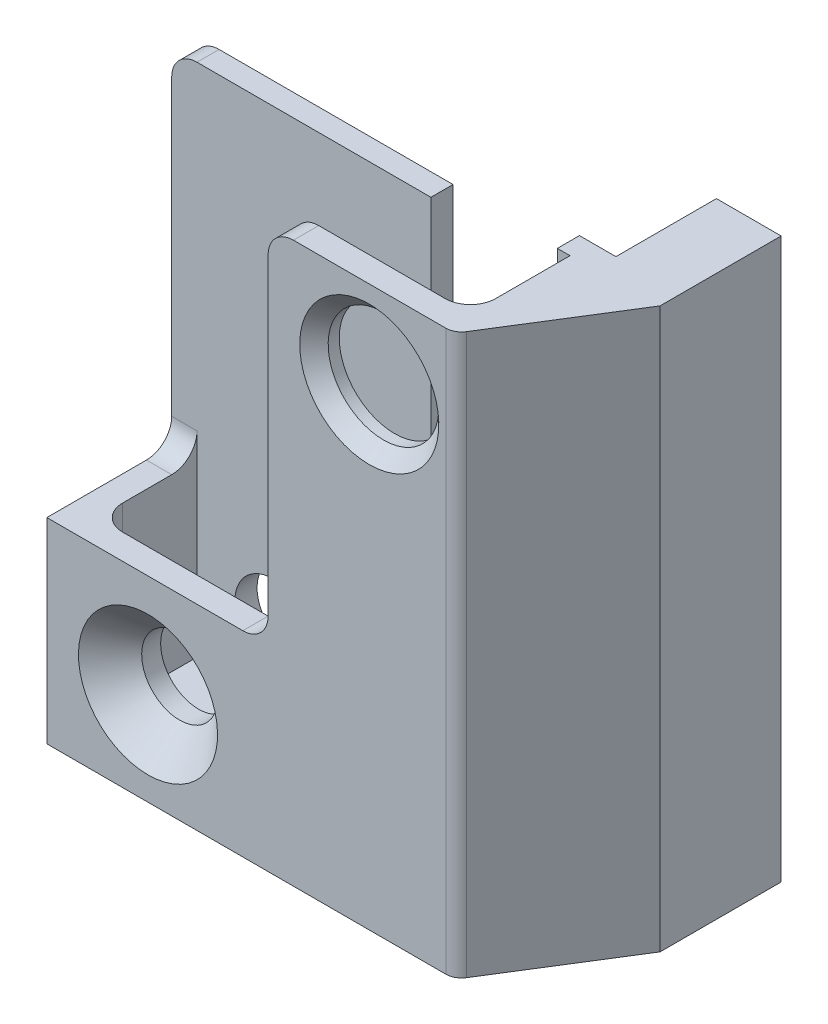
ISO-10303-21;
HEADER;
FILE_DESCRIPTION(('STEP AP214'),'2;1');
FILE_NAME('part.step','',(''),(''),'','','');
FILE_SCHEMA(('AUTOMOTIVE_DESIGN { 1 0 10303 214 1 1 1 1 }'));
ENDSEC;
DATA;
#1=APPLICATION_CONTEXT('core data for automotive mechanical design processes');
#2=APPLICATION_PROTOCOL_DEFINITION('international standard','automotive_design',2000,#1);
#3=PRODUCT_CONTEXT('',#1,'mechanical');
#4=PRODUCT('Part','Part','',(#3));
#5=PRODUCT_RELATED_PRODUCT_CATEGORY('part','',(#4));
#6=PRODUCT_DEFINITION_FORMATION('','',#4);
#7=PRODUCT_DEFINITION_CONTEXT('part definition',#1,'design');
#8=PRODUCT_DEFINITION('design','',#6,#7);
#9=PRODUCT_DEFINITION_SHAPE('','',#8);
#10=(LENGTH_UNIT() NAMED_UNIT(*) SI_UNIT(.MILLI.,.METRE.));
#11=(NAMED_UNIT(*) PLANE_ANGLE_UNIT() SI_UNIT($,.RADIAN.));
#12=(NAMED_UNIT(*) SI_UNIT($,.STERADIAN.) SOLID_ANGLE_UNIT());
#13=UNCERTAINTY_MEASURE_WITH_UNIT(LENGTH_MEASURE(1.E-05),#10,'distance_accuracy_value','');
#14=(GEOMETRIC_REPRESENTATION_CONTEXT(3) GLOBAL_UNCERTAINTY_ASSIGNED_CONTEXT((#13)) GLOBAL_UNIT_ASSIGNED_CONTEXT((#10,
#11,#12)) REPRESENTATION_CONTEXT('',''));
#15=CARTESIAN_POINT('',(0.,0.,0.));
#16=DIRECTION('',(0.,0.,1.));
#17=DIRECTION('',(1.,0.,0.));
#18=AXIS2_PLACEMENT_3D('',#15,#16,#17);
#19=CARTESIAN_POINT('',(15.4,17.7,3.85));
#20=DIRECTION('',(0.,0.,1.));
#21=DIRECTION('',(1.,0.,0.));
#22=AXIS2_PLACEMENT_3D('',#19,#20,#21);
#23=PLANE('',#22);
#24=CARTESIAN_POINT('',(10.2,14.95,3.85));
#25=DIRECTION('',(0.,0.,-1.));
#26=DIRECTION('',(0.,1.,0.));
#27=AXIS2_PLACEMENT_3D('',#24,#25,#26);
#28=CIRCLE('',#27,1.75);
#29=CARTESIAN_POINT('',(11.8,14.2411276560621,3.85));
#30=VERTEX_POINT('',#29);
#31=CARTESIAN_POINT('',(11.8,15.6588723439379,3.85));
#32=VERTEX_POINT('',#31);
#33=EDGE_CURVE('E51',#30,#32,#28,.T.);
#34=ORIENTED_EDGE('',*,*,#33,.F.);
#35=DIRECTION('',(0.,-1.,0.));
#36=VECTOR('',#35,1.);
#37=CARTESIAN_POINT('',(11.8,17.7,3.85));
#38=LINE('',#37,#36);
#39=CARTESIAN_POINT('',(11.8,0.800000000000002,3.85));
#40=VERTEX_POINT('',#39);
#41=EDGE_CURVE('E237',#30,#40,#38,.T.);
#42=ORIENTED_EDGE('',*,*,#41,.T.);
#43=DIRECTION('',(-1.,0.,0.));
#44=VECTOR('',#43,1.);
#45=CARTESIAN_POINT('',(15.4,0.800000000000002,3.85));
#46=LINE('',#45,#44);
#47=CARTESIAN_POINT('',(5.05,0.800000000000002,3.85));
#48=VERTEX_POINT('',#47);
#49=EDGE_CURVE('E337',#40,#48,#46,.T.);
#50=ORIENTED_EDGE('',*,*,#49,.T.);
#51=DIRECTION('',(0.,-1.,0.));
#52=VECTOR('',#51,1.);
#53=CARTESIAN_POINT('',(5.05,0.800000000000002,3.85));
#54=LINE('',#53,#52);
#55=CARTESIAN_POINT('',(5.05,2.95,3.85));
#56=VERTEX_POINT('',#55);
#57=EDGE_CURVE('E485',#56,#48,#54,.T.);
#58=ORIENTED_EDGE('',*,*,#57,.F.);
#59=CARTESIAN_POINT('',(3.2,2.95,3.85));
#60=DIRECTION('',(0.,0.,-1.));
#61=DIRECTION('',(0.,1.,0.));
#62=AXIS2_PLACEMENT_3D('',#59,#60,#61);
#63=CIRCLE('',#62,1.85);
#64=CARTESIAN_POINT('',(3.2,4.8,3.85));
#65=VERTEX_POINT('',#64);
#66=EDGE_CURVE('E482',#65,#56,#63,.T.);
#67=ORIENTED_EDGE('',*,*,#66,.F.);
#68=DIRECTION('',(1.,0.,0.));
#69=VECTOR('',#68,1.);
#70=CARTESIAN_POINT('',(0.8,4.8,3.85));
#71=LINE('',#70,#69);
#72=CARTESIAN_POINT('',(1.6,4.8,3.85));
#73=VERTEX_POINT('',#72);
#74=EDGE_CURVE('E476',#73,#65,#71,.T.);
#75=ORIENTED_EDGE('',*,*,#74,.F.);
#76=DIRECTION('',(0.,1.,0.));
#77=VECTOR('',#76,1.);
#78=CARTESIAN_POINT('',(1.6,17.7,3.85));
#79=LINE('',#78,#77);
#80=CARTESIAN_POINT('',(1.6,6.2,3.85));
#81=VERTEX_POINT('',#80);
#82=EDGE_CURVE('E248',#73,#81,#79,.T.);
#83=ORIENTED_EDGE('',*,*,#82,.T.);
#84=DIRECTION('',(-1.,0.,0.));
#85=VECTOR('',#84,1.);
#86=CARTESIAN_POINT('',(0.,6.2,3.85));
#87=LINE('',#86,#85);
#88=CARTESIAN_POINT('',(6.2,6.2,3.85));
#89=VERTEX_POINT('',#88);
#90=EDGE_CURVE('E384',#89,#81,#87,.T.);
#91=ORIENTED_EDGE('',*,*,#90,.F.);
#92=CARTESIAN_POINT('',(6.2,7.,3.85));
#93=DIRECTION('',(0.,0.,1.));
#94=DIRECTION('',(1.,0.,0.));
#95=AXIS2_PLACEMENT_3D('',#92,#93,#94);
#96=CIRCLE('',#95,0.8);
#97=CARTESIAN_POINT('',(7.,7.,3.85));
#98=VERTEX_POINT('',#97);
#99=EDGE_CURVE('E286',#89,#98,#96,.T.);
#100=ORIENTED_EDGE('',*,*,#99,.T.);
#101=DIRECTION('',(0.,-1.,0.));
#102=VECTOR('',#101,1.);
#103=CARTESIAN_POINT('',(7.,17.7,3.85));
#104=LINE('',#103,#102);
#105=CARTESIAN_POINT('',(7.,16.9,3.85));
#106=VERTEX_POINT('',#105);
#107=EDGE_CURVE('E374',#106,#98,#104,.T.);
#108=ORIENTED_EDGE('',*,*,#107,.F.);
#109=CARTESIAN_POINT('',(7.8,16.9,3.85));
#110=DIRECTION('',(0.,0.,1.));
#111=DIRECTION('',(1.,0.,0.));
#112=AXIS2_PLACEMENT_3D('',#109,#110,#111);
#113=CIRCLE('',#112,0.8);
#114=CARTESIAN_POINT('',(7.8,17.7,3.85));
#115=VERTEX_POINT('',#114);
#116=EDGE_CURVE('E255',#106,#115,#113,.F.);
#117=ORIENTED_EDGE('',*,*,#116,.T.);
#118=DIRECTION('',(-1.,0.,0.));
#119=VECTOR('',#118,1.);
#120=CARTESIAN_POINT('',(15.4,17.7,3.85));
#121=LINE('',#120,#119);
#122=CARTESIAN_POINT('',(11.8,17.7,3.85));
#123=VERTEX_POINT('',#122);
#124=EDGE_CURVE('E329',#123,#115,#121,.T.);
#125=ORIENTED_EDGE('',*,*,#124,.F.);
#126=EDGE_CURVE('E240',#123,#32,#38,.T.);
#127=ORIENTED_EDGE('',*,*,#126,.T.);
#128=EDGE_LOOP('',(#34,#42,#50,#58,#67,#75,#83,#91,#100,#108,#117,#125,#127));
#129=FACE_BOUND('',#128,.T.);
#130=ADVANCED_FACE('F37',(#129),#23,.F.);
#131=CARTESIAN_POINT('',(10.2,14.95,4.65000000000001));
#132=DIRECTION('',(0.,0.,1.));
#133=DIRECTION('',(0.,-1.,0.));
#134=AXIS2_PLACEMENT_3D('',#131,#132,#133);
#135=CONICAL_SURFACE('',#134,2.2,0.785398163397448);
#136=CARTESIAN_POINT('',(10.2,14.95,4.65000000000001));
#137=DIRECTION('',(0.,0.,1.));
#138=DIRECTION('',(0.,-1.,0.));
#139=AXIS2_PLACEMENT_3D('',#136,#137,#138);
#140=CIRCLE('',#139,2.2);
#141=CARTESIAN_POINT('',(10.2,12.75,4.65000000000001));
#142=VERTEX_POINT('',#141);
#143=EDGE_CURVE('E779',#142,#142,#140,.T.);
#144=ORIENTED_EDGE('',*,*,#143,.T.);
#145=EDGE_LOOP('',(#144));
#146=FACE_BOUND('',#145,.T.);
#147=CARTESIAN_POINT('',(10.2,14.95,4.20000000000001));
#148=DIRECTION('',(0.,0.,1.));
#149=DIRECTION('',(0.,-1.,0.));
#150=AXIS2_PLACEMENT_3D('',#147,#148,#149);
#151=CIRCLE('',#150,1.75);
#152=CARTESIAN_POINT('',(10.2,13.2,4.20000000000001));
#153=VERTEX_POINT('',#152);
#154=EDGE_CURVE('E234',#153,#153,#151,.T.);
#155=ORIENTED_EDGE('',*,*,#154,.F.);
#156=EDGE_LOOP('',(#155));
#157=FACE_BOUND('',#156,.T.);
#158=ADVANCED_FACE('F534',(#146,#157),#135,.F.);
#159=CARTESIAN_POINT('',(11.8,17.7,3.05));
#160=DIRECTION('',(0.,-1.,0.));
#161=DIRECTION('',(0.,0.,-1.));
#162=AXIS2_PLACEMENT_3D('',#159,#160,#161);
#163=CYLINDRICAL_SURFACE('',#162,0.8);
#164=CARTESIAN_POINT('',(11.8,14.2411276560621,3.85));
#165=CARTESIAN_POINT('',(11.8197520033515,14.2856989660172,3.84997509137289));
#166=CARTESIAN_POINT('',(11.8376280852819,14.3310869894427,3.84926787894186));
#167=CARTESIAN_POINT('',(11.8695301151469,14.4231797790748,3.84713968779438));
#168=CARTESIAN_POINT('',(11.8835562359279,14.4698844860642,3.84571874112957));
#169=CARTESIAN_POINT('',(11.9076557401795,14.5642741124911,3.84281453924065));
#170=CARTESIAN_POINT('',(11.9177311217147,14.6119585235732,3.84133131593391));
#171=CARTESIAN_POINT('',(11.9338719277806,14.7080101076177,3.83876232294299));
#172=CARTESIAN_POINT('',(11.9399376056709,14.756377237244,3.83767652814859));
#173=CARTESIAN_POINT('',(11.9480393413239,14.8537660557022,3.83619426665757));
#174=CARTESIAN_POINT('',(11.9500498074692,14.902789948169,3.83580217970468));
#175=CARTESIAN_POINT('',(11.949948317069,15.0008333416383,3.83582154345329));
#176=CARTESIAN_POINT('',(11.9478363521634,15.0498528426315,3.83623299578431));
#177=CARTESIAN_POINT('',(11.9395120584169,15.1474703261501,3.83775267471414));
#178=CARTESIAN_POINT('',(11.9333047251143,15.196068749228,3.83886005234391));
#179=CARTESIAN_POINT('',(11.9168447560813,15.2925470485341,3.84146435682536));
#180=CARTESIAN_POINT('',(11.9065934750459,15.3404271598219,3.84296115316731));
#181=CARTESIAN_POINT('',(11.8823670396819,15.4341857232004,3.84584150639183));
#182=CARTESIAN_POINT('',(11.8684730898844,15.4800850920066,3.84722676259739));
#183=CARTESIAN_POINT('',(11.8369857173729,15.5705417228839,3.8492939754285));
#184=CARTESIAN_POINT('',(11.8193973223879,15.6151007157939,3.8499768805037));
#185=CARTESIAN_POINT('',(11.8,15.6588723439379,3.85));
#186=B_SPLINE_CURVE_WITH_KNOTS('',3,(#164,#165,#166,#167,#168,#169,#170,#171,#172,#173,#174,
#175,#176,#177,#178,#179,#180,#181,#182,#183,#184,#185),.UNSPECIFIED.,.F.,.F.,(4,2,2,2,2,2,2,2,
2,2,4),(0.,0.14619105360609,0.292375542801339,0.438486004345154,0.584587232781439,
0.731607627380318,0.878628320126676,1.02547000749487,1.17226254561721,1.31602611255964,
1.45959528635212),.UNSPECIFIED.);
#187=EDGE_CURVE('E227',#30,#32,#186,.T.);
#188=ORIENTED_EDGE('',*,*,#187,.T.);
#189=ORIENTED_EDGE('',*,*,#126,.F.);
#190=CARTESIAN_POINT('',(11.8,17.7,3.05));
#191=DIRECTION('',(0.,-1.,0.));
#192=DIRECTION('',(0.,0.,-1.));
#193=AXIS2_PLACEMENT_3D('',#190,#191,#192);
#194=CIRCLE('',#193,0.8);
#195=CARTESIAN_POINT('',(12.6,17.7,3.05));
#196=VERTEX_POINT('',#195);
#197=EDGE_CURVE('E290',#196,#123,#194,.T.);
#198=ORIENTED_EDGE('',*,*,#197,.F.);
#199=DIRECTION('',(0.,-1.,0.));
#200=VECTOR('',#199,1.);
#201=CARTESIAN_POINT('',(12.6,0.,3.05));
#202=LINE('',#201,#200);
#203=CARTESIAN_POINT('',(12.6,0.800000000000002,3.05));
#204=VERTEX_POINT('',#203);
#205=EDGE_CURVE('E278',#204,#196,#202,.F.);
#206=ORIENTED_EDGE('',*,*,#205,.F.);
#207=CARTESIAN_POINT('',(11.8,0.800000000000002,3.05));
#208=DIRECTION('',(0.,-1.,0.));
#209=DIRECTION('',(0.,0.,-1.));
#210=AXIS2_PLACEMENT_3D('',#207,#208,#209);
#211=CIRCLE('',#210,0.8);
#212=EDGE_CURVE('E244',#40,#204,#211,.F.);
#213=ORIENTED_EDGE('',*,*,#212,.F.);
#214=ORIENTED_EDGE('',*,*,#41,.F.);
#215=EDGE_LOOP('',(#188,#189,#198,#206,#213,#214));
#216=FACE_BOUND('',#215,.T.);
#217=ADVANCED_FACE('F242',(#216),#163,.F.);
#218=CARTESIAN_POINT('',(15.4,17.7,0.));
#219=DIRECTION('',(0.,0.,1.));
#220=DIRECTION('',(0.,-1.,0.));
#221=AXIS2_PLACEMENT_3D('',#218,#219,#220);
#222=PLANE('',#221);
#223=CARTESIAN_POINT('',(3.2,2.95,0.));
#224=DIRECTION('',(0.,0.,1.));
#225=DIRECTION('',(0.,-1.,0.));
#226=AXIS2_PLACEMENT_3D('',#223,#224,#225);
#227=CIRCLE('',#226,1.2);
#228=CARTESIAN_POINT('',(3.2,1.75,0.));
#229=VERTEX_POINT('',#228);
#230=EDGE_CURVE('E353',#229,#229,#227,.T.);
#231=ORIENTED_EDGE('',*,*,#230,.T.);
#232=EDGE_LOOP('',(#231));
#233=FACE_BOUND('',#232,.T.);
#234=DIRECTION('',(0.,1.,0.));
#235=VECTOR('',#234,1.);
#236=CARTESIAN_POINT('',(13.3525,0.,0.));
#237=LINE('',#236,#235);
#238=CARTESIAN_POINT('',(13.3525,0.,0.));
#239=VERTEX_POINT('',#238);
#240=CARTESIAN_POINT('',(13.3525,17.7,0.));
#241=VERTEX_POINT('',#240);
#242=EDGE_CURVE('E772',#239,#241,#237,.T.);
#243=ORIENTED_EDGE('',*,*,#242,.F.);
#244=DIRECTION('',(-1.,0.,0.));
#245=VECTOR('',#244,1.);
#246=CARTESIAN_POINT('',(15.4,0.,0.));
#247=LINE('',#246,#245);
#248=CARTESIAN_POINT('',(0.,0.,0.));
#249=VERTEX_POINT('',#248);
#250=EDGE_CURVE('E327',#239,#249,#247,.T.);
#251=ORIENTED_EDGE('',*,*,#250,.T.);
#252=DIRECTION('',(0.,1.,0.));
#253=VECTOR('',#252,1.);
#254=CARTESIAN_POINT('',(0.,17.7,0.));
#255=LINE('',#254,#253);
#256=CARTESIAN_POINT('',(0.,16.3,0.));
#257=VERTEX_POINT('',#256);
#258=EDGE_CURVE('E382',#249,#257,#255,.T.);
#259=ORIENTED_EDGE('',*,*,#258,.T.);
#260=CARTESIAN_POINT('',(0.8,16.3,0.));
#261=DIRECTION('',(0.,0.,1.));
#262=DIRECTION('',(0.,-1.,0.));
#263=AXIS2_PLACEMENT_3D('',#260,#261,#262);
#264=CIRCLE('',#263,0.8);
#265=CARTESIAN_POINT('',(0.800000000000004,17.1,0.));
#266=VERTEX_POINT('',#265);
#267=EDGE_CURVE('E271',#257,#266,#264,.F.);
#268=ORIENTED_EDGE('',*,*,#267,.T.);
#269=DIRECTION('',(-1.,0.,0.));
#270=VECTOR('',#269,1.);
#271=CARTESIAN_POINT('',(15.4,17.1,0.));
#272=LINE('',#271,#270);
#273=CARTESIAN_POINT('',(8.2,17.1,0.));
#274=VERTEX_POINT('',#273);
#275=EDGE_CURVE('E345',#274,#266,#272,.T.);
#276=ORIENTED_EDGE('',*,*,#275,.F.);
#277=DIRECTION('',(0.,1.,0.));
#278=VECTOR('',#277,1.);
#279=CARTESIAN_POINT('',(8.2,1.4,0.));
#280=LINE('',#279,#278);
#281=CARTESIAN_POINT('',(8.2,1.4,0.));
#282=VERTEX_POINT('',#281);
#283=EDGE_CURVE('E429',#282,#274,#280,.T.);
#284=ORIENTED_EDGE('',*,*,#283,.F.);
#285=DIRECTION('',(-1.,0.,0.));
#286=VECTOR('',#285,1.);
#287=CARTESIAN_POINT('',(12.2,1.4,0.));
#288=LINE('',#287,#286);
#289=CARTESIAN_POINT('',(12.2,1.4,0.));
#290=VERTEX_POINT('',#289);
#291=EDGE_CURVE('E503',#290,#282,#288,.T.);
#292=ORIENTED_EDGE('',*,*,#291,.F.);
#293=DIRECTION('',(0.,1.,0.));
#294=VECTOR('',#293,1.);
#295=CARTESIAN_POINT('',(12.2,1.4,0.));
#296=LINE('',#295,#294);
#297=CARTESIAN_POINT('',(12.2,17.7,0.));
#298=VERTEX_POINT('',#297);
#299=EDGE_CURVE('E431',#290,#298,#296,.T.);
#300=ORIENTED_EDGE('',*,*,#299,.T.);
#301=DIRECTION('',(-1.,0.,0.));
#302=VECTOR('',#301,1.);
#303=CARTESIAN_POINT('',(15.4,17.7,0.));
#304=LINE('',#303,#302);
#305=EDGE_CURVE('E346',#241,#298,#304,.T.);
#306=ORIENTED_EDGE('',*,*,#305,.F.);
#307=EDGE_LOOP('',(#243,#251,#259,#268,#276,#284,#292,#300,#306));
#308=FACE_BOUND('',#307,.T.);
#309=ADVANCED_FACE('F410',(#233,#308),#222,.F.);
#310=CARTESIAN_POINT('',(15.4,0.800000000000002,3.85));
#311=DIRECTION('',(0.,-1.,0.));
#312=DIRECTION('',(0.,0.,-1.));
#313=AXIS2_PLACEMENT_3D('',#310,#311,#312);
#314=PLANE('',#313);
#315=ORIENTED_EDGE('',*,*,#49,.F.);
#316=ORIENTED_EDGE('',*,*,#212,.T.);
#317=DIRECTION('',(0.,0.,-1.));
#318=VECTOR('',#317,1.);
#319=CARTESIAN_POINT('',(12.6,0.800000000000002,3.85));
#320=LINE('',#319,#318);
#321=CARTESIAN_POINT('',(12.6,0.800000000000002,0.700000000000003));
#322=VERTEX_POINT('',#321);
#323=EDGE_CURVE('E440',#204,#322,#320,.T.);
#324=ORIENTED_EDGE('',*,*,#323,.T.);
#325=DIRECTION('',(-1.,0.,0.));
#326=VECTOR('',#325,1.);
#327=CARTESIAN_POINT('',(15.4,0.800000000000002,0.700000000000003));
#328=LINE('',#327,#326);
#329=CARTESIAN_POINT('',(0.8,0.800000000000002,0.700000000000003));
#330=VERTEX_POINT('',#329);
#331=EDGE_CURVE('E339',#322,#330,#328,.T.);
#332=ORIENTED_EDGE('',*,*,#331,.T.);
#333=DIRECTION('',(0.,0.,1.));
#334=VECTOR('',#333,1.);
#335=CARTESIAN_POINT('',(0.8,0.800000000000002,3.85));
#336=LINE('',#335,#334);
#337=CARTESIAN_POINT('',(0.8,0.800000000000002,3.05));
#338=VERTEX_POINT('',#337);
#339=EDGE_CURVE('E448',#330,#338,#336,.T.);
#340=ORIENTED_EDGE('',*,*,#339,.T.);
#341=DIRECTION('',(-1.,0.,0.));
#342=VECTOR('',#341,1.);
#343=CARTESIAN_POINT('',(0.8,0.800000000000002,3.05));
#344=LINE('',#343,#342);
#345=CARTESIAN_POINT('',(5.05,0.800000000000002,3.05));
#346=VERTEX_POINT('',#345);
#347=EDGE_CURVE('E490',#346,#338,#344,.T.);
#348=ORIENTED_EDGE('',*,*,#347,.F.);
#349=DIRECTION('',(0.,0.,1.));
#350=VECTOR('',#349,1.);
#351=CARTESIAN_POINT('',(5.05,0.800000000000002,3.05));
#352=LINE('',#351,#350);
#353=EDGE_CURVE('E496',#346,#48,#352,.T.);
#354=ORIENTED_EDGE('',*,*,#353,.T.);
#355=EDGE_LOOP('',(#315,#316,#324,#332,#340,#348,#354));
#356=FACE_BOUND('',#355,.T.);
#357=ADVANCED_FACE('F544',(#356),#314,.F.);
#358=CARTESIAN_POINT('',(0.8,0.,0.));
#359=DIRECTION('',(1.,0.,0.));
#360=DIRECTION('',(0.,0.,-1.));
#361=AXIS2_PLACEMENT_3D('',#358,#359,#360);
#362=PLANE('',#361);
#363=DIRECTION('',(0.,0.,1.));
#364=VECTOR('',#363,1.);
#365=CARTESIAN_POINT('',(0.8,6.2,0.));
#366=LINE('',#365,#364);
#367=CARTESIAN_POINT('',(0.8,6.2,1.5));
#368=VERTEX_POINT('',#367);
#369=CARTESIAN_POINT('',(0.8,6.2,3.05));
#370=VERTEX_POINT('',#369);
#371=EDGE_CURVE('E445',#368,#370,#366,.T.);
#372=ORIENTED_EDGE('',*,*,#371,.T.);
#373=DIRECTION('',(0.,1.,0.));
#374=VECTOR('',#373,1.);
#375=CARTESIAN_POINT('',(0.8,0.,3.05));
#376=LINE('',#375,#374);
#377=CARTESIAN_POINT('',(0.8,4.8,3.05));
#378=VERTEX_POINT('',#377);
#379=EDGE_CURVE('E273',#370,#378,#376,.F.);
#380=ORIENTED_EDGE('',*,*,#379,.T.);
#381=DIRECTION('',(0.,1.,0.));
#382=VECTOR('',#381,1.);
#383=CARTESIAN_POINT('',(0.8,0.800000000000002,3.05));
#384=LINE('',#383,#382);
#385=EDGE_CURVE('E495',#338,#378,#384,.T.);
#386=ORIENTED_EDGE('',*,*,#385,.F.);
#387=ORIENTED_EDGE('',*,*,#339,.F.);
#388=DIRECTION('',(0.,-1.,0.));
#389=VECTOR('',#388,1.);
#390=CARTESIAN_POINT('',(0.8,0.800000000000002,0.700000000000003));
#391=LINE('',#390,#389);
#392=CARTESIAN_POINT('',(0.8,7.,0.700000000000002));
#393=VERTEX_POINT('',#392);
#394=EDGE_CURVE('E389',#393,#330,#391,.T.);
#395=ORIENTED_EDGE('',*,*,#394,.F.);
#396=CARTESIAN_POINT('',(0.8,7.,1.5));
#397=DIRECTION('',(1.,0.,0.));
#398=DIRECTION('',(0.,0.,-1.));
#399=AXIS2_PLACEMENT_3D('',#396,#397,#398);
#400=CIRCLE('',#399,0.8);
#401=EDGE_CURVE('E280',#393,#368,#400,.F.);
#402=ORIENTED_EDGE('',*,*,#401,.T.);
#403=EDGE_LOOP('',(#372,#380,#386,#387,#395,#402));
#404=FACE_BOUND('',#403,.T.);
#405=ADVANCED_FACE('F456',(#404),#362,.T.);
#406=CARTESIAN_POINT('',(15.4,17.7,4.65));
#407=DIRECTION('',(0.,-1.,0.));
#408=DIRECTION('',(0.,0.,-1.));
#409=AXIS2_PLACEMENT_3D('',#406,#407,#408);
#410=PLANE('',#409);
#411=DIRECTION('',(-1.,0.,0.));
#412=VECTOR('',#411,1.);
#413=CARTESIAN_POINT('',(15.4,17.7,4.65));
#414=LINE('',#413,#412);
#415=CARTESIAN_POINT('',(12.6228761792465,17.7,4.65));
#416=VERTEX_POINT('',#415);
#417=CARTESIAN_POINT('',(7.8,17.7,4.65));
#418=VERTEX_POINT('',#417);
#419=EDGE_CURVE('E308',#416,#418,#414,.T.);
#420=ORIENTED_EDGE('',*,*,#419,.F.);
#421=CARTESIAN_POINT('',(12.6228761792465,17.7,4.15));
#422=DIRECTION('',(0.,-1.,0.));
#423=DIRECTION('',(0.,0.,-1.));
#424=AXIS2_PLACEMENT_3D('',#421,#422,#423);
#425=CIRCLE('',#424,0.5);
#426=CARTESIAN_POINT('',(13.046875331249,17.7,4.41499947000159));
#427=VERTEX_POINT('',#426);
#428=EDGE_CURVE('E302',#416,#427,#425,.F.);
#429=ORIENTED_EDGE('',*,*,#428,.T.);
#430=DIRECTION('',(-0.529998940003179,0.,0.847998304005089));
#431=VECTOR('',#430,1.);
#432=CARTESIAN_POINT('',(15.4,17.7,0.649999999999986));
#433=LINE('',#432,#431);
#434=CARTESIAN_POINT('',(15.4,17.7,0.649999999999982));
#435=VERTEX_POINT('',#434);
#436=EDGE_CURVE('E297',#427,#435,#433,.F.);
#437=ORIENTED_EDGE('',*,*,#436,.T.);
#438=DIRECTION('',(0.,0.,1.));
#439=VECTOR('',#438,1.);
#440=CARTESIAN_POINT('',(15.4,17.7,0.700000000000001));
#441=LINE('',#440,#439);
#442=CARTESIAN_POINT('',(15.4,17.7,-3.18));
#443=VERTEX_POINT('',#442);
#444=EDGE_CURVE('E391',#443,#435,#441,.T.);
#445=ORIENTED_EDGE('',*,*,#444,.F.);
#446=DIRECTION('',(-1.,0.,0.));
#447=VECTOR('',#446,1.);
#448=CARTESIAN_POINT('',(13.3525,17.7,-3.18));
#449=LINE('',#448,#447);
#450=CARTESIAN_POINT('',(13.3525,17.7,-3.18));
#451=VERTEX_POINT('',#450);
#452=EDGE_CURVE('E769',#443,#451,#449,.T.);
#453=ORIENTED_EDGE('',*,*,#452,.T.);
#454=DIRECTION('',(0.,0.,1.));
#455=VECTOR('',#454,1.);
#456=CARTESIAN_POINT('',(13.3525,17.7,0.));
#457=LINE('',#456,#455);
#458=EDGE_CURVE('E765',#451,#241,#457,.T.);
#459=ORIENTED_EDGE('',*,*,#458,.T.);
#460=ORIENTED_EDGE('',*,*,#305,.T.);
#461=DIRECTION('',(0.,0.,-1.));
#462=VECTOR('',#461,1.);
#463=CARTESIAN_POINT('',(12.2,17.7,0.7));
#464=LINE('',#463,#462);
#465=CARTESIAN_POINT('',(12.2,17.7,0.7));
#466=VERTEX_POINT('',#465);
#467=EDGE_CURVE('E360',#466,#298,#464,.T.);
#468=ORIENTED_EDGE('',*,*,#467,.F.);
#469=DIRECTION('',(-1.,0.,0.));
#470=VECTOR('',#469,1.);
#471=CARTESIAN_POINT('',(15.4,17.7,0.700000000000001));
#472=LINE('',#471,#470);
#473=CARTESIAN_POINT('',(12.6,17.7,0.700000000000001));
#474=VERTEX_POINT('',#473);
#475=EDGE_CURVE('E342',#474,#466,#472,.T.);
#476=ORIENTED_EDGE('',*,*,#475,.F.);
#477=DIRECTION('',(0.,0.,1.));
#478=VECTOR('',#477,1.);
#479=CARTESIAN_POINT('',(12.6,17.7,0.));
#480=LINE('',#479,#478);
#481=EDGE_CURVE('E437',#474,#196,#480,.T.);
#482=ORIENTED_EDGE('',*,*,#481,.T.);
#483=ORIENTED_EDGE('',*,*,#197,.T.);
#484=ORIENTED_EDGE('',*,*,#124,.T.);
#485=DIRECTION('',(0.,0.,1.));
#486=VECTOR('',#485,1.);
#487=CARTESIAN_POINT('',(7.8,17.7,4.65));
#488=LINE('',#487,#486);
#489=EDGE_CURVE('E348',#115,#418,#488,.T.);
#490=ORIENTED_EDGE('',*,*,#489,.T.);
#491=EDGE_LOOP('',(#420,#429,#437,#445,#453,#459,#460,#468,#476,#482,#483,#484,#490));
#492=FACE_BOUND('',#491,.T.);
#493=ADVANCED_FACE('F305',(#492),#410,.F.);
#494=CARTESIAN_POINT('',(15.4,0.800000000000002,0.700000000000003));
#495=DIRECTION('',(0.,0.,-1.));
#496=DIRECTION('',(0.,1.,0.));
#497=AXIS2_PLACEMENT_3D('',#494,#495,#496);
#498=PLANE('',#497);
#499=CARTESIAN_POINT('',(3.2,2.95,0.700000000000003));
#500=DIRECTION('',(0.,0.,-1.));
#501=DIRECTION('',(0.,1.,0.));
#502=AXIS2_PLACEMENT_3D('',#499,#500,#501);
#503=CIRCLE('',#502,1.2);
#504=CARTESIAN_POINT('',(3.2,4.15,0.700000000000003));
#505=VERTEX_POINT('',#504);
#506=EDGE_CURVE('E352',#505,#505,#503,.T.);
#507=ORIENTED_EDGE('',*,*,#506,.T.);
#508=EDGE_LOOP('',(#507));
#509=FACE_BOUND('',#508,.T.);
#510=DIRECTION('',(0.,-1.,0.));
#511=VECTOR('',#510,1.);
#512=CARTESIAN_POINT('',(0.,0.800000000000002,0.700000000000003));
#513=LINE('',#512,#511);
#514=CARTESIAN_POINT('',(0.,16.3,0.700000000000001));
#515=VERTEX_POINT('',#514);
#516=CARTESIAN_POINT('',(0.,7.,0.700000000000002));
#517=VERTEX_POINT('',#516);
#518=EDGE_CURVE('E397',#515,#517,#513,.T.);
#519=ORIENTED_EDGE('',*,*,#518,.T.);
#520=DIRECTION('',(1.,0.,0.));
#521=VECTOR('',#520,1.);
#522=CARTESIAN_POINT('',(0.8,7.,0.700000000000003));
#523=LINE('',#522,#521);
#524=EDGE_CURVE('E259',#517,#393,#523,.T.);
#525=ORIENTED_EDGE('',*,*,#524,.T.);
#526=ORIENTED_EDGE('',*,*,#394,.T.);
#527=ORIENTED_EDGE('',*,*,#331,.F.);
#528=DIRECTION('',(0.,1.,0.));
#529=VECTOR('',#528,1.);
#530=CARTESIAN_POINT('',(12.6,0.800000000000002,0.700000000000003));
#531=LINE('',#530,#529);
#532=EDGE_CURVE('E442',#322,#474,#531,.T.);
#533=ORIENTED_EDGE('',*,*,#532,.T.);
#534=ORIENTED_EDGE('',*,*,#475,.T.);
#535=DIRECTION('',(0.,1.,0.));
#536=VECTOR('',#535,1.);
#537=CARTESIAN_POINT('',(12.2,1.4,0.7));
#538=LINE('',#537,#536);
#539=CARTESIAN_POINT('',(12.2,1.4,0.7));
#540=VERTEX_POINT('',#539);
#541=EDGE_CURVE('E428',#540,#466,#538,.T.);
#542=ORIENTED_EDGE('',*,*,#541,.F.);
#543=DIRECTION('',(1.,0.,0.));
#544=VECTOR('',#543,1.);
#545=CARTESIAN_POINT('',(8.2,1.4,0.700000000000001));
#546=LINE('',#545,#544);
#547=CARTESIAN_POINT('',(8.2,1.4,0.700000000000001));
#548=VERTEX_POINT('',#547);
#549=EDGE_CURVE('E425',#548,#540,#546,.T.);
#550=ORIENTED_EDGE('',*,*,#549,.F.);
#551=DIRECTION('',(0.,1.,0.));
#552=VECTOR('',#551,1.);
#553=CARTESIAN_POINT('',(8.2,1.4,0.700000000000001));
#554=LINE('',#553,#552);
#555=CARTESIAN_POINT('',(8.2,17.1,0.700000000000001));
#556=VERTEX_POINT('',#555);
#557=EDGE_CURVE('E423',#548,#556,#554,.T.);
#558=ORIENTED_EDGE('',*,*,#557,.T.);
#559=DIRECTION('',(-1.,0.,0.));
#560=VECTOR('',#559,1.);
#561=CARTESIAN_POINT('',(15.4,17.1,0.700000000000001));
#562=LINE('',#561,#560);
#563=CARTESIAN_POINT('',(0.800000000000004,17.1,0.700000000000001));
#564=VERTEX_POINT('',#563);
#565=EDGE_CURVE('E341',#556,#564,#562,.T.);
#566=ORIENTED_EDGE('',*,*,#565,.T.);
#567=CARTESIAN_POINT('',(0.8,16.3,0.700000000000001));
#568=DIRECTION('',(0.,0.,-1.));
#569=DIRECTION('',(0.,1.,0.));
#570=AXIS2_PLACEMENT_3D('',#567,#568,#569);
#571=CIRCLE('',#570,0.8);
#572=EDGE_CURVE('E257',#564,#515,#571,.F.);
#573=ORIENTED_EDGE('',*,*,#572,.T.);
#574=EDGE_LOOP('',(#519,#525,#526,#527,#533,#534,#542,#550,#558,#566,#573));
#575=FACE_BOUND('',#574,.T.);
#576=ADVANCED_FACE('F421',(#509,#575),#498,.F.);
#577=CARTESIAN_POINT('',(15.4,17.1,4.65));
#578=DIRECTION('',(0.,-1.,0.));
#579=DIRECTION('',(0.,0.,-1.));
#580=AXIS2_PLACEMENT_3D('',#577,#578,#579);
#581=PLANE('',#580);
#582=ORIENTED_EDGE('',*,*,#275,.T.);
#583=DIRECTION('',(0.,0.,1.));
#584=VECTOR('',#583,1.);
#585=CARTESIAN_POINT('',(0.8,17.1,0.700000000000001));
#586=LINE('',#585,#584);
#587=EDGE_CURVE('E266',#266,#564,#586,.T.);
#588=ORIENTED_EDGE('',*,*,#587,.T.);
#589=ORIENTED_EDGE('',*,*,#565,.F.);
#590=DIRECTION('',(0.,0.,1.));
#591=VECTOR('',#590,1.);
#592=CARTESIAN_POINT('',(8.2,17.1,0.));
#593=LINE('',#592,#591);
#594=EDGE_CURVE('E358',#274,#556,#593,.T.);
#595=ORIENTED_EDGE('',*,*,#594,.F.);
#596=EDGE_LOOP('',(#582,#588,#589,#595));
#597=FACE_BOUND('',#596,.T.);
#598=ADVANCED_FACE('F417',(#597),#581,.F.);
#599=CARTESIAN_POINT('',(15.4,0.,4.65000000000001));
#600=DIRECTION('',(0.,0.,-1.));
#601=DIRECTION('',(0.,1.,0.));
#602=AXIS2_PLACEMENT_3D('',#599,#600,#601);
#603=PLANE('',#602);
#604=ORIENTED_EDGE('',*,*,#143,.F.);
#605=EDGE_LOOP('',(#604));
#606=FACE_BOUND('',#605,.T.);
#607=CARTESIAN_POINT('',(3.2,2.95,4.65000000000001));
#608=DIRECTION('',(0.,0.,1.));
#609=DIRECTION('',(0.,-1.,0.));
#610=AXIS2_PLACEMENT_3D('',#607,#608,#609);
#611=CIRCLE('',#610,2.2);
#612=CARTESIAN_POINT('',(3.2,0.75,4.65000000000001));
#613=VERTEX_POINT('',#612);
#614=EDGE_CURVE('E786',#613,#613,#611,.T.);
#615=ORIENTED_EDGE('',*,*,#614,.F.);
#616=EDGE_LOOP('',(#615));
#617=FACE_BOUND('',#616,.T.);
#618=DIRECTION('',(-1.,0.,0.));
#619=VECTOR('',#618,1.);
#620=CARTESIAN_POINT('',(15.4,0.,4.65000000000001));
#621=LINE('',#620,#619);
#622=CARTESIAN_POINT('',(12.6228761792465,0.,4.65000000000001));
#623=VERTEX_POINT('',#622);
#624=CARTESIAN_POINT('',(0.,0.,4.65000000000001));
#625=VERTEX_POINT('',#624);
#626=EDGE_CURVE('E318',#623,#625,#621,.T.);
#627=ORIENTED_EDGE('',*,*,#626,.F.);
#628=DIRECTION('',(0.,-1.,0.));
#629=VECTOR('',#628,1.);
#630=CARTESIAN_POINT('',(12.6228761792465,17.7,4.65));
#631=LINE('',#630,#629);
#632=EDGE_CURVE('E299',#623,#416,#631,.F.);
#633=ORIENTED_EDGE('',*,*,#632,.T.);
#634=ORIENTED_EDGE('',*,*,#419,.T.);
#635=CARTESIAN_POINT('',(7.8,16.9,4.65));
#636=DIRECTION('',(0.,0.,-1.));
#637=DIRECTION('',(0.,1.,0.));
#638=AXIS2_PLACEMENT_3D('',#635,#636,#637);
#639=CIRCLE('',#638,0.8);
#640=CARTESIAN_POINT('',(7.,16.9,4.65000000000001));
#641=VERTEX_POINT('',#640);
#642=EDGE_CURVE('E363',#418,#641,#639,.F.);
#643=ORIENTED_EDGE('',*,*,#642,.T.);
#644=DIRECTION('',(0.,1.,0.));
#645=VECTOR('',#644,1.);
#646=CARTESIAN_POINT('',(7.,17.7,4.65000000000001));
#647=LINE('',#646,#645);
#648=CARTESIAN_POINT('',(7.,7.,4.65000000000001));
#649=VERTEX_POINT('',#648);
#650=EDGE_CURVE('E371',#649,#641,#647,.T.);
#651=ORIENTED_EDGE('',*,*,#650,.F.);
#652=CARTESIAN_POINT('',(6.2,7.,4.65));
#653=DIRECTION('',(0.,0.,-1.));
#654=DIRECTION('',(0.,1.,0.));
#655=AXIS2_PLACEMENT_3D('',#652,#653,#654);
#656=CIRCLE('',#655,0.8);
#657=CARTESIAN_POINT('',(6.2,6.2,4.65000000000001));
#658=VERTEX_POINT('',#657);
#659=EDGE_CURVE('E284',#649,#658,#656,.T.);
#660=ORIENTED_EDGE('',*,*,#659,.T.);
#661=DIRECTION('',(1.,0.,0.));
#662=VECTOR('',#661,1.);
#663=CARTESIAN_POINT('',(0.,6.2,4.65000000000001));
#664=LINE('',#663,#662);
#665=CARTESIAN_POINT('',(0.,6.2,4.65000000000001));
#666=VERTEX_POINT('',#665);
#667=EDGE_CURVE('E380',#666,#658,#664,.T.);
#668=ORIENTED_EDGE('',*,*,#667,.F.);
#669=DIRECTION('',(0.,-1.,0.));
#670=VECTOR('',#669,1.);
#671=CARTESIAN_POINT('',(0.,0.,4.65000000000001));
#672=LINE('',#671,#670);
#673=EDGE_CURVE('E325',#666,#625,#672,.T.);
#674=ORIENTED_EDGE('',*,*,#673,.T.);
#675=EDGE_LOOP('',(#627,#633,#634,#643,#651,#660,#668,#674));
#676=FACE_BOUND('',#675,.T.);
#677=ADVANCED_FACE('F322',(#606,#617,#676),#603,.F.);
#678=CARTESIAN_POINT('',(15.4,0.,0.));
#679=DIRECTION('',(0.,1.,0.));
#680=DIRECTION('',(0.,0.,1.));
#681=AXIS2_PLACEMENT_3D('',#678,#679,#680);
#682=PLANE('',#681);
#683=DIRECTION('',(0.529998940003179,0.,-0.847998304005089));
#684=VECTOR('',#683,1.);
#685=CARTESIAN_POINT('',(15.4,0.,0.649999999999988));
#686=LINE('',#685,#684);
#687=CARTESIAN_POINT('',(15.4,0.,0.649999999999988));
#688=VERTEX_POINT('',#687);
#689=CARTESIAN_POINT('',(13.046875331249,0.,4.4149994700016));
#690=VERTEX_POINT('',#689);
#691=EDGE_CURVE('E295',#688,#690,#686,.F.);
#692=ORIENTED_EDGE('',*,*,#691,.T.);
#693=CARTESIAN_POINT('',(12.6228761792465,0.,4.15000000000001));
#694=DIRECTION('',(0.,1.,0.));
#695=DIRECTION('',(0.,0.,1.));
#696=AXIS2_PLACEMENT_3D('',#693,#694,#695);
#697=CIRCLE('',#696,0.5);
#698=EDGE_CURVE('E12',#690,#623,#697,.F.);
#699=ORIENTED_EDGE('',*,*,#698,.T.);
#700=ORIENTED_EDGE('',*,*,#626,.T.);
#701=DIRECTION('',(0.,0.,-1.));
#702=VECTOR('',#701,1.);
#703=CARTESIAN_POINT('',(0.,0.,0.));
#704=LINE('',#703,#702);
#705=EDGE_CURVE('E393',#625,#249,#704,.T.);
#706=ORIENTED_EDGE('',*,*,#705,.T.);
#707=ORIENTED_EDGE('',*,*,#250,.F.);
#708=DIRECTION('',(0.,0.,1.));
#709=VECTOR('',#708,1.);
#710=CARTESIAN_POINT('',(13.3525,0.,0.));
#711=LINE('',#710,#709);
#712=CARTESIAN_POINT('',(13.3525,0.,-3.18));
#713=VERTEX_POINT('',#712);
#714=EDGE_CURVE('E766',#713,#239,#711,.T.);
#715=ORIENTED_EDGE('',*,*,#714,.F.);
#716=DIRECTION('',(-1.,0.,0.));
#717=VECTOR('',#716,1.);
#718=CARTESIAN_POINT('',(13.3525,0.,-3.18));
#719=LINE('',#718,#717);
#720=CARTESIAN_POINT('',(15.4,0.,-3.18));
#721=VERTEX_POINT('',#720);
#722=EDGE_CURVE('E768',#721,#713,#719,.T.);
#723=ORIENTED_EDGE('',*,*,#722,.F.);
#724=DIRECTION('',(0.,0.,-1.));
#725=VECTOR('',#724,1.);
#726=CARTESIAN_POINT('',(15.4,0.,0.));
#727=LINE('',#726,#725);
#728=EDGE_CURVE('E331',#688,#721,#727,.T.);
#729=ORIENTED_EDGE('',*,*,#728,.F.);
#730=EDGE_LOOP('',(#692,#699,#700,#706,#707,#715,#723,#729));
#731=FACE_BOUND('',#730,.T.);
#732=ADVANCED_FACE('F316',(#731),#682,.F.);
#733=CARTESIAN_POINT('',(15.4,0.,0.));
#734=DIRECTION('',(-1.,0.,0.));
#735=DIRECTION('',(0.,0.,1.));
#736=AXIS2_PLACEMENT_3D('',#733,#734,#735);
#737=PLANE('',#736);
#738=ORIENTED_EDGE('',*,*,#444,.T.);
#739=DIRECTION('',(0.,-1.,0.));
#740=VECTOR('',#739,1.);
#741=CARTESIAN_POINT('',(15.4,0.,0.649999999999988));
#742=LINE('',#741,#740);
#743=EDGE_CURVE('E292',#435,#688,#742,.T.);
#744=ORIENTED_EDGE('',*,*,#743,.T.);
#745=ORIENTED_EDGE('',*,*,#728,.T.);
#746=DIRECTION('',(0.,1.,0.));
#747=VECTOR('',#746,1.);
#748=CARTESIAN_POINT('',(15.4,0.,-3.18));
#749=LINE('',#748,#747);
#750=EDGE_CURVE('E780',#721,#443,#749,.T.);
#751=ORIENTED_EDGE('',*,*,#750,.T.);
#752=EDGE_LOOP('',(#738,#744,#745,#751));
#753=FACE_BOUND('',#752,.T.);
#754=ADVANCED_FACE('F675',(#753),#737,.F.);
#755=CARTESIAN_POINT('',(0.,0.,0.));
#756=DIRECTION('',(-1.,0.,0.));
#757=DIRECTION('',(0.,0.,1.));
#758=AXIS2_PLACEMENT_3D('',#755,#756,#757);
#759=PLANE('',#758);
#760=ORIENTED_EDGE('',*,*,#518,.F.);
#761=DIRECTION('',(0.,0.,1.));
#762=VECTOR('',#761,1.);
#763=CARTESIAN_POINT('',(0.,16.3,0.));
#764=LINE('',#763,#762);
#765=EDGE_CURVE('E269',#515,#257,#764,.F.);
#766=ORIENTED_EDGE('',*,*,#765,.T.);
#767=ORIENTED_EDGE('',*,*,#258,.F.);
#768=ORIENTED_EDGE('',*,*,#705,.F.);
#769=ORIENTED_EDGE('',*,*,#673,.F.);
#770=DIRECTION('',(0.,0.,1.));
#771=VECTOR('',#770,1.);
#772=CARTESIAN_POINT('',(0.,6.2,-0.00100000000000013));
#773=LINE('',#772,#771);
#774=CARTESIAN_POINT('',(0.,6.2,1.5));
#775=VERTEX_POINT('',#774);
#776=EDGE_CURVE('E379',#775,#666,#773,.T.);
#777=ORIENTED_EDGE('',*,*,#776,.F.);
#778=CARTESIAN_POINT('',(0.,7.,1.5));
#779=DIRECTION('',(-1.,0.,0.));
#780=DIRECTION('',(0.,0.,1.));
#781=AXIS2_PLACEMENT_3D('',#778,#779,#780);
#782=CIRCLE('',#781,0.8);
#783=EDGE_CURVE('E282',#775,#517,#782,.F.);
#784=ORIENTED_EDGE('',*,*,#783,.T.);
#785=EDGE_LOOP('',(#760,#766,#767,#768,#769,#777,#784));
#786=FACE_BOUND('',#785,.T.);
#787=ADVANCED_FACE('F406',(#786),#759,.T.);
#788=CARTESIAN_POINT('',(0.,6.2,-0.00100000000000013));
#789=DIRECTION('',(0.,-1.,0.));
#790=DIRECTION('',(0.,0.,-1.));
#791=AXIS2_PLACEMENT_3D('',#788,#789,#790);
#792=PLANE('',#791);
#793=ORIENTED_EDGE('',*,*,#371,.F.);
#794=DIRECTION('',(1.,0.,0.));
#795=VECTOR('',#794,1.);
#796=CARTESIAN_POINT('',(0.,6.2,1.5));
#797=LINE('',#796,#795);
#798=EDGE_CURVE('E264',#368,#775,#797,.F.);
#799=ORIENTED_EDGE('',*,*,#798,.T.);
#800=ORIENTED_EDGE('',*,*,#776,.T.);
#801=ORIENTED_EDGE('',*,*,#667,.T.);
#802=DIRECTION('',(0.,0.,1.));
#803=VECTOR('',#802,1.);
#804=CARTESIAN_POINT('',(6.2,6.2,3.85));
#805=LINE('',#804,#803);
#806=EDGE_CURVE('E262',#658,#89,#805,.F.);
#807=ORIENTED_EDGE('',*,*,#806,.T.);
#808=ORIENTED_EDGE('',*,*,#90,.T.);
#809=CARTESIAN_POINT('',(1.6,6.2,3.05));
#810=DIRECTION('',(0.,-1.,0.));
#811=DIRECTION('',(0.,0.,-1.));
#812=AXIS2_PLACEMENT_3D('',#809,#810,#811);
#813=CIRCLE('',#812,0.8);
#814=EDGE_CURVE('E288',#81,#370,#813,.T.);
#815=ORIENTED_EDGE('',*,*,#814,.T.);
#816=EDGE_LOOP('',(#793,#799,#800,#801,#807,#808,#815));
#817=FACE_BOUND('',#816,.T.);
#818=ADVANCED_FACE('F464',(#817),#792,.F.);
#819=CARTESIAN_POINT('',(7.,17.7,-0.00100000000000013));
#820=DIRECTION('',(1.,0.,0.));
#821=DIRECTION('',(0.,1.,0.));
#822=AXIS2_PLACEMENT_3D('',#819,#820,#821);
#823=PLANE('',#822);
#824=ORIENTED_EDGE('',*,*,#650,.T.);
#825=DIRECTION('',(0.,0.,1.));
#826=VECTOR('',#825,1.);
#827=CARTESIAN_POINT('',(7.,16.9,-0.00100000000000013));
#828=LINE('',#827,#826);
#829=EDGE_CURVE('E246',#641,#106,#828,.F.);
#830=ORIENTED_EDGE('',*,*,#829,.T.);
#831=ORIENTED_EDGE('',*,*,#107,.T.);
#832=DIRECTION('',(0.,0.,1.));
#833=VECTOR('',#832,1.);
#834=CARTESIAN_POINT('',(7.,7.,4.65000000000001));
#835=LINE('',#834,#833);
#836=EDGE_CURVE('E249',#98,#649,#835,.T.);
#837=ORIENTED_EDGE('',*,*,#836,.T.);
#838=EDGE_LOOP('',(#824,#830,#831,#837));
#839=FACE_BOUND('',#838,.T.);
#840=ADVANCED_FACE('F370',(#839),#823,.F.);
#841=CARTESIAN_POINT('',(12.6,0.,0.));
#842=DIRECTION('',(-1.,0.,0.));
#843=DIRECTION('',(0.,0.,1.));
#844=AXIS2_PLACEMENT_3D('',#841,#842,#843);
#845=PLANE('',#844);
#846=ORIENTED_EDGE('',*,*,#323,.F.);
#847=ORIENTED_EDGE('',*,*,#205,.T.);
#848=ORIENTED_EDGE('',*,*,#481,.F.);
#849=ORIENTED_EDGE('',*,*,#532,.F.);
#850=EDGE_LOOP('',(#846,#847,#848,#849));
#851=FACE_BOUND('',#850,.T.);
#852=ADVANCED_FACE('F530',(#851),#845,.T.);
#853=CARTESIAN_POINT('',(12.2,1.4,0.7));
#854=DIRECTION('',(1.,0.,0.));
#855=DIRECTION('',(0.,0.,-1.));
#856=AXIS2_PLACEMENT_3D('',#853,#854,#855);
#857=PLANE('',#856);
#858=ORIENTED_EDGE('',*,*,#467,.T.);
#859=ORIENTED_EDGE('',*,*,#299,.F.);
#860=DIRECTION('',(0.,0.,-1.));
#861=VECTOR('',#860,1.);
#862=CARTESIAN_POINT('',(12.2,1.4,0.7));
#863=LINE('',#862,#861);
#864=EDGE_CURVE('E433',#540,#290,#863,.T.);
#865=ORIENTED_EDGE('',*,*,#864,.F.);
#866=ORIENTED_EDGE('',*,*,#541,.T.);
#867=EDGE_LOOP('',(#858,#859,#865,#866));
#868=FACE_BOUND('',#867,.T.);
#869=ADVANCED_FACE('F518',(#868),#857,.F.);
#870=CARTESIAN_POINT('',(8.2,1.4,0.));
#871=DIRECTION('',(-1.,0.,0.));
#872=DIRECTION('',(0.,0.,1.));
#873=AXIS2_PLACEMENT_3D('',#870,#871,#872);
#874=PLANE('',#873);
#875=ORIENTED_EDGE('',*,*,#594,.T.);
#876=ORIENTED_EDGE('',*,*,#557,.F.);
#877=DIRECTION('',(0.,0.,1.));
#878=VECTOR('',#877,1.);
#879=CARTESIAN_POINT('',(8.2,1.4,0.));
#880=LINE('',#879,#878);
#881=EDGE_CURVE('E506',#282,#548,#880,.T.);
#882=ORIENTED_EDGE('',*,*,#881,.F.);
#883=ORIENTED_EDGE('',*,*,#283,.T.);
#884=EDGE_LOOP('',(#875,#876,#882,#883));
#885=FACE_BOUND('',#884,.T.);
#886=ADVANCED_FACE('F522',(#885),#874,.F.);
#887=CARTESIAN_POINT('',(0.,1.4,0.));
#888=DIRECTION('',(0.,1.,0.));
#889=DIRECTION('',(0.,0.,1.));
#890=AXIS2_PLACEMENT_3D('',#887,#888,#889);
#891=PLANE('',#890);
#892=ORIENTED_EDGE('',*,*,#291,.T.);
#893=ORIENTED_EDGE('',*,*,#881,.T.);
#894=ORIENTED_EDGE('',*,*,#549,.T.);
#895=ORIENTED_EDGE('',*,*,#864,.T.);
#896=EDGE_LOOP('',(#892,#893,#894,#895));
#897=FACE_BOUND('',#896,.T.);
#898=ADVANCED_FACE('F521',(#897),#891,.T.);
#899=CARTESIAN_POINT('',(0.8,4.8,3.05));
#900=DIRECTION('',(0.,-1.,0.));
#901=DIRECTION('',(1.,0.,0.));
#902=AXIS2_PLACEMENT_3D('',#899,#900,#901);
#903=PLANE('',#902);
#904=DIRECTION('',(1.,0.,0.));
#905=VECTOR('',#904,1.);
#906=CARTESIAN_POINT('',(0.8,4.8,3.05));
#907=LINE('',#906,#905);
#908=CARTESIAN_POINT('',(3.2,4.8,3.05));
#909=VERTEX_POINT('',#908);
#910=EDGE_CURVE('E478',#378,#909,#907,.T.);
#911=ORIENTED_EDGE('',*,*,#910,.F.);
#912=CARTESIAN_POINT('',(1.6,4.8,3.05));
#913=DIRECTION('',(0.,-1.,0.));
#914=DIRECTION('',(1.,0.,0.));
#915=AXIS2_PLACEMENT_3D('',#912,#913,#914);
#916=CIRCLE('',#915,0.8);
#917=EDGE_CURVE('E275',#378,#73,#916,.F.);
#918=ORIENTED_EDGE('',*,*,#917,.T.);
#919=ORIENTED_EDGE('',*,*,#74,.T.);
#920=DIRECTION('',(0.,0.,1.));
#921=VECTOR('',#920,1.);
#922=CARTESIAN_POINT('',(3.2,4.8,3.05));
#923=LINE('',#922,#921);
#924=EDGE_CURVE('E361',#909,#65,#923,.T.);
#925=ORIENTED_EDGE('',*,*,#924,.F.);
#926=EDGE_LOOP('',(#911,#918,#919,#925));
#927=FACE_BOUND('',#926,.T.);
#928=ADVANCED_FACE('F474',(#927),#903,.F.);
#929=CARTESIAN_POINT('',(3.2,2.95,3.05));
#930=DIRECTION('',(0.,0.,1.));
#931=DIRECTION('',(0.,-1.,0.));
#932=AXIS2_PLACEMENT_3D('',#929,#930,#931);
#933=CYLINDRICAL_SURFACE('',#932,1.85);
#934=ORIENTED_EDGE('',*,*,#66,.T.);
#935=DIRECTION('',(0.,0.,1.));
#936=VECTOR('',#935,1.);
#937=CARTESIAN_POINT('',(5.05,2.95,3.05));
#938=LINE('',#937,#936);
#939=CARTESIAN_POINT('',(5.05,2.95,3.05));
#940=VERTEX_POINT('',#939);
#941=EDGE_CURVE('E499',#940,#56,#938,.T.);
#942=ORIENTED_EDGE('',*,*,#941,.F.);
#943=CARTESIAN_POINT('',(3.2,2.95,3.05));
#944=DIRECTION('',(0.,0.,-1.));
#945=DIRECTION('',(0.,1.,0.));
#946=AXIS2_PLACEMENT_3D('',#943,#944,#945);
#947=CIRCLE('',#946,1.85);
#948=EDGE_CURVE('E796',#909,#940,#947,.T.);
#949=ORIENTED_EDGE('',*,*,#948,.F.);
#950=ORIENTED_EDGE('',*,*,#924,.T.);
#951=EDGE_LOOP('',(#934,#942,#949,#950));
#952=FACE_BOUND('',#951,.T.);
#953=ADVANCED_FACE('F605',(#952),#933,.T.);
#954=CARTESIAN_POINT('',(5.05,0.800000000000002,3.05));
#955=DIRECTION('',(-1.,0.,0.));
#956=DIRECTION('',(0.,0.,1.));
#957=AXIS2_PLACEMENT_3D('',#954,#955,#956);
#958=PLANE('',#957);
#959=ORIENTED_EDGE('',*,*,#57,.T.);
#960=ORIENTED_EDGE('',*,*,#353,.F.);
#961=DIRECTION('',(0.,-1.,0.));
#962=VECTOR('',#961,1.);
#963=CARTESIAN_POINT('',(5.05,0.800000000000002,3.05));
#964=LINE('',#963,#962);
#965=EDGE_CURVE('E797',#940,#346,#964,.T.);
#966=ORIENTED_EDGE('',*,*,#965,.F.);
#967=ORIENTED_EDGE('',*,*,#941,.T.);
#968=EDGE_LOOP('',(#959,#960,#966,#967));
#969=FACE_BOUND('',#968,.T.);
#970=ADVANCED_FACE('F601',(#969),#958,.F.);
#971=CARTESIAN_POINT('',(3.2,2.95,3.05));
#972=DIRECTION('',(0.,0.,-1.));
#973=DIRECTION('',(0.,1.,0.));
#974=AXIS2_PLACEMENT_3D('',#971,#972,#973);
#975=PLANE('',#974);
#976=CARTESIAN_POINT('',(3.2,2.95,3.05));
#977=DIRECTION('',(0.,0.,-1.));
#978=DIRECTION('',(0.,1.,0.));
#979=AXIS2_PLACEMENT_3D('',#976,#977,#978);
#980=CIRCLE('',#979,1.2);
#981=CARTESIAN_POINT('',(3.2,4.15,3.05));
#982=VERTEX_POINT('',#981);
#983=EDGE_CURVE('E349',#982,#982,#980,.T.);
#984=ORIENTED_EDGE('',*,*,#983,.F.);
#985=EDGE_LOOP('',(#984));
#986=FACE_BOUND('',#985,.T.);
#987=ORIENTED_EDGE('',*,*,#385,.T.);
#988=ORIENTED_EDGE('',*,*,#910,.T.);
#989=ORIENTED_EDGE('',*,*,#948,.T.);
#990=ORIENTED_EDGE('',*,*,#965,.T.);
#991=ORIENTED_EDGE('',*,*,#347,.T.);
#992=EDGE_LOOP('',(#987,#988,#989,#990,#991));
#993=FACE_BOUND('',#992,.T.);
#994=ADVANCED_FACE('F594',(#986,#993),#975,.T.);
#995=CARTESIAN_POINT('',(3.2,2.95,4.65000000000001));
#996=DIRECTION('',(0.,0.,1.));
#997=DIRECTION('',(0.,-1.,0.));
#998=AXIS2_PLACEMENT_3D('',#995,#996,#997);
#999=CONICAL_SURFACE('',#998,2.2,0.785398163397447);
#1000=CARTESIAN_POINT('',(3.2,2.95,3.65));
#1001=DIRECTION('',(0.,0.,1.));
#1002=DIRECTION('',(0.,-1.,0.));
#1003=AXIS2_PLACEMENT_3D('',#1000,#1001,#1002);
#1004=CIRCLE('',#1003,1.2);
#1005=CARTESIAN_POINT('',(3.2,1.75,3.65000000000001));
#1006=VERTEX_POINT('',#1005);
#1007=EDGE_CURVE('E789',#1006,#1006,#1004,.T.);
#1008=ORIENTED_EDGE('',*,*,#1007,.F.);
#1009=EDGE_LOOP('',(#1008));
#1010=FACE_BOUND('',#1009,.T.);
#1011=ORIENTED_EDGE('',*,*,#614,.T.);
#1012=EDGE_LOOP('',(#1011));
#1013=FACE_BOUND('',#1012,.T.);
#1014=ADVANCED_FACE('F590',(#1010,#1013),#999,.F.);
#1015=CARTESIAN_POINT('',(3.2,2.95,4.65000000000001));
#1016=DIRECTION('',(0.,0.,1.));
#1017=DIRECTION('',(0.,-1.,0.));
#1018=AXIS2_PLACEMENT_3D('',#1015,#1016,#1017);
#1019=CYLINDRICAL_SURFACE('',#1018,1.2);
#1020=ORIENTED_EDGE('',*,*,#983,.T.);
#1021=EDGE_LOOP('',(#1020));
#1022=FACE_BOUND('',#1021,.T.);
#1023=ORIENTED_EDGE('',*,*,#1007,.T.);
#1024=EDGE_LOOP('',(#1023));
#1025=FACE_BOUND('',#1024,.T.);
#1026=ADVANCED_FACE('F593',(#1022,#1025),#1019,.F.);
#1027=ORIENTED_EDGE('',*,*,#230,.F.);
#1028=EDGE_LOOP('',(#1027));
#1029=FACE_BOUND('',#1028,.T.);
#1030=ORIENTED_EDGE('',*,*,#506,.F.);
#1031=EDGE_LOOP('',(#1030));
#1032=FACE_BOUND('',#1031,.T.);
#1033=ADVANCED_FACE('F559',(#1029,#1032),#1019,.F.);
#1034=CARTESIAN_POINT('',(7.8,16.9,4.65));
#1035=DIRECTION('',(0.,0.,1.));
#1036=DIRECTION('',(1.,0.,0.));
#1037=AXIS2_PLACEMENT_3D('',#1034,#1035,#1036);
#1038=CYLINDRICAL_SURFACE('',#1037,0.8);
#1039=ORIENTED_EDGE('',*,*,#116,.F.);
#1040=ORIENTED_EDGE('',*,*,#829,.F.);
#1041=ORIENTED_EDGE('',*,*,#642,.F.);
#1042=ORIENTED_EDGE('',*,*,#489,.F.);
#1043=EDGE_LOOP('',(#1039,#1040,#1041,#1042));
#1044=FACE_BOUND('',#1043,.T.);
#1045=ADVANCED_FACE('F556',(#1044),#1038,.T.);
#1046=CARTESIAN_POINT('',(15.4,7.,1.5));
#1047=DIRECTION('',(-1.,0.,0.));
#1048=DIRECTION('',(0.,0.,1.));
#1049=AXIS2_PLACEMENT_3D('',#1046,#1047,#1048);
#1050=CYLINDRICAL_SURFACE('',#1049,0.8);
#1051=ORIENTED_EDGE('',*,*,#783,.F.);
#1052=ORIENTED_EDGE('',*,*,#798,.F.);
#1053=ORIENTED_EDGE('',*,*,#401,.F.);
#1054=ORIENTED_EDGE('',*,*,#524,.F.);
#1055=EDGE_LOOP('',(#1051,#1052,#1053,#1054));
#1056=FACE_BOUND('',#1055,.T.);
#1057=ADVANCED_FACE('F461',(#1056),#1050,.F.);
#1058=CARTESIAN_POINT('',(6.2,7.,-0.00100000000000013));
#1059=DIRECTION('',(0.,0.,-1.));
#1060=DIRECTION('',(-1.,0.,0.));
#1061=AXIS2_PLACEMENT_3D('',#1058,#1059,#1060);
#1062=CYLINDRICAL_SURFACE('',#1061,0.8);
#1063=ORIENTED_EDGE('',*,*,#99,.F.);
#1064=ORIENTED_EDGE('',*,*,#806,.F.);
#1065=ORIENTED_EDGE('',*,*,#659,.F.);
#1066=ORIENTED_EDGE('',*,*,#836,.F.);
#1067=EDGE_LOOP('',(#1063,#1064,#1065,#1066));
#1068=FACE_BOUND('',#1067,.T.);
#1069=ADVANCED_FACE('F563',(#1068),#1062,.F.);
#1070=CARTESIAN_POINT('',(0.8,16.3,4.65));
#1071=DIRECTION('',(0.,0.,-1.));
#1072=DIRECTION('',(-1.,0.,0.));
#1073=AXIS2_PLACEMENT_3D('',#1070,#1071,#1072);
#1074=CYLINDRICAL_SURFACE('',#1073,0.8);
#1075=ORIENTED_EDGE('',*,*,#267,.F.);
#1076=ORIENTED_EDGE('',*,*,#765,.F.);
#1077=ORIENTED_EDGE('',*,*,#572,.F.);
#1078=ORIENTED_EDGE('',*,*,#587,.F.);
#1079=EDGE_LOOP('',(#1075,#1076,#1077,#1078));
#1080=FACE_BOUND('',#1079,.T.);
#1081=ADVANCED_FACE('F414',(#1080),#1074,.T.);
#1082=CARTESIAN_POINT('',(1.6,17.7,3.05));
#1083=DIRECTION('',(0.,1.,0.));
#1084=DIRECTION('',(0.,0.,1.));
#1085=AXIS2_PLACEMENT_3D('',#1082,#1083,#1084);
#1086=CYLINDRICAL_SURFACE('',#1085,0.8);
#1087=ORIENTED_EDGE('',*,*,#917,.F.);
#1088=ORIENTED_EDGE('',*,*,#379,.F.);
#1089=ORIENTED_EDGE('',*,*,#814,.F.);
#1090=ORIENTED_EDGE('',*,*,#82,.F.);
#1091=EDGE_LOOP('',(#1087,#1088,#1089,#1090));
#1092=FACE_BOUND('',#1091,.T.);
#1093=ADVANCED_FACE('F470',(#1092),#1086,.F.);
#1094=CARTESIAN_POINT('',(15.4,0.,0.649999999999988));
#1095=DIRECTION('',(-0.847998304005089,0.,-0.529998940003179));
#1096=DIRECTION('',(0.,-1.,0.));
#1097=AXIS2_PLACEMENT_3D('',#1094,#1095,#1096);
#1098=PLANE('',#1097);
#1099=ORIENTED_EDGE('',*,*,#436,.F.);
#1100=DIRECTION('',(0.,1.,0.));
#1101=VECTOR('',#1100,1.);
#1102=CARTESIAN_POINT('',(13.046875331249,0.,4.4149994700016));
#1103=LINE('',#1102,#1101);
#1104=EDGE_CURVE('E45',#427,#690,#1103,.F.);
#1105=ORIENTED_EDGE('',*,*,#1104,.T.);
#1106=ORIENTED_EDGE('',*,*,#691,.F.);
#1107=ORIENTED_EDGE('',*,*,#743,.F.);
#1108=EDGE_LOOP('',(#1099,#1105,#1106,#1107));
#1109=FACE_BOUND('',#1108,.T.);
#1110=ADVANCED_FACE('F312',(#1109),#1098,.F.);
#1111=CARTESIAN_POINT('',(13.3525,0.,0.));
#1112=DIRECTION('',(-1.,0.,0.));
#1113=DIRECTION('',(0.,0.,1.));
#1114=AXIS2_PLACEMENT_3D('',#1111,#1112,#1113);
#1115=PLANE('',#1114);
#1116=ORIENTED_EDGE('',*,*,#458,.F.);
#1117=DIRECTION('',(0.,1.,0.));
#1118=VECTOR('',#1117,1.);
#1119=CARTESIAN_POINT('',(13.3525,0.,-3.18));
#1120=LINE('',#1119,#1118);
#1121=EDGE_CURVE('E777',#713,#451,#1120,.T.);
#1122=ORIENTED_EDGE('',*,*,#1121,.F.);
#1123=ORIENTED_EDGE('',*,*,#714,.T.);
#1124=ORIENTED_EDGE('',*,*,#242,.T.);
#1125=EDGE_LOOP('',(#1116,#1122,#1123,#1124));
#1126=FACE_BOUND('',#1125,.T.);
#1127=ADVANCED_FACE('F575',(#1126),#1115,.T.);
#1128=CARTESIAN_POINT('',(13.3525,0.,-3.18));
#1129=DIRECTION('',(0.,0.,-1.));
#1130=DIRECTION('',(-1.,0.,0.));
#1131=AXIS2_PLACEMENT_3D('',#1128,#1129,#1130);
#1132=PLANE('',#1131);
#1133=ORIENTED_EDGE('',*,*,#452,.F.);
#1134=ORIENTED_EDGE('',*,*,#750,.F.);
#1135=ORIENTED_EDGE('',*,*,#722,.T.);
#1136=ORIENTED_EDGE('',*,*,#1121,.T.);
#1137=EDGE_LOOP('',(#1133,#1134,#1135,#1136));
#1138=FACE_BOUND('',#1137,.T.);
#1139=ADVANCED_FACE('F579',(#1138),#1132,.T.);
#1140=CARTESIAN_POINT('',(12.6228761792465,0.,4.15000000000001));
#1141=DIRECTION('',(0.,1.,0.));
#1142=DIRECTION('',(0.,0.,1.));
#1143=AXIS2_PLACEMENT_3D('',#1140,#1141,#1142);
#1144=CYLINDRICAL_SURFACE('',#1143,0.5);
#1145=ORIENTED_EDGE('',*,*,#698,.F.);
#1146=ORIENTED_EDGE('',*,*,#1104,.F.);
#1147=ORIENTED_EDGE('',*,*,#428,.F.);
#1148=ORIENTED_EDGE('',*,*,#632,.F.);
#1149=EDGE_LOOP('',(#1145,#1146,#1147,#1148));
#1150=FACE_BOUND('',#1149,.T.);
#1151=ADVANCED_FACE('F39',(#1150),#1144,.T.);
#1152=CARTESIAN_POINT('',(10.2,14.95,-3.181));
#1153=DIRECTION('',(0.,0.,1.));
#1154=DIRECTION('',(0.,-1.,0.));
#1155=AXIS2_PLACEMENT_3D('',#1152,#1153,#1154);
#1156=CYLINDRICAL_SURFACE('',#1155,1.75);
#1157=ORIENTED_EDGE('',*,*,#187,.F.);
#1158=ORIENTED_EDGE('',*,*,#33,.T.);
#1159=EDGE_LOOP('',(#1157,#1158));
#1160=FACE_BOUND('',#1159,.T.);
#1161=ORIENTED_EDGE('',*,*,#154,.T.);
#1162=EDGE_LOOP('',(#1161));
#1163=FACE_BOUND('',#1162,.T.);
#1164=ADVANCED_FACE('F228',(#1160,#1163),#1156,.F.);
#1165=CLOSED_SHELL('',(#130,#158,#217,#309,#357,#405,#493,#576,#598,#677,#732,#754,#787,#818,
#840,#852,#869,#886,#898,#928,#953,#970,#994,#1014,#1026,#1033,#1045,#1057,#1069,#1081,#1093,
#1110,#1127,#1139,#1151,#1164));
#1166=MANIFOLD_SOLID_BREP('B2',#1165);
#1167=ADVANCED_BREP_SHAPE_REPRESENTATION('',(#18,#1166),#14);
#1168=SHAPE_DEFINITION_REPRESENTATION(#9,#1167);
ENDSEC;
END-ISO-10303-21;
